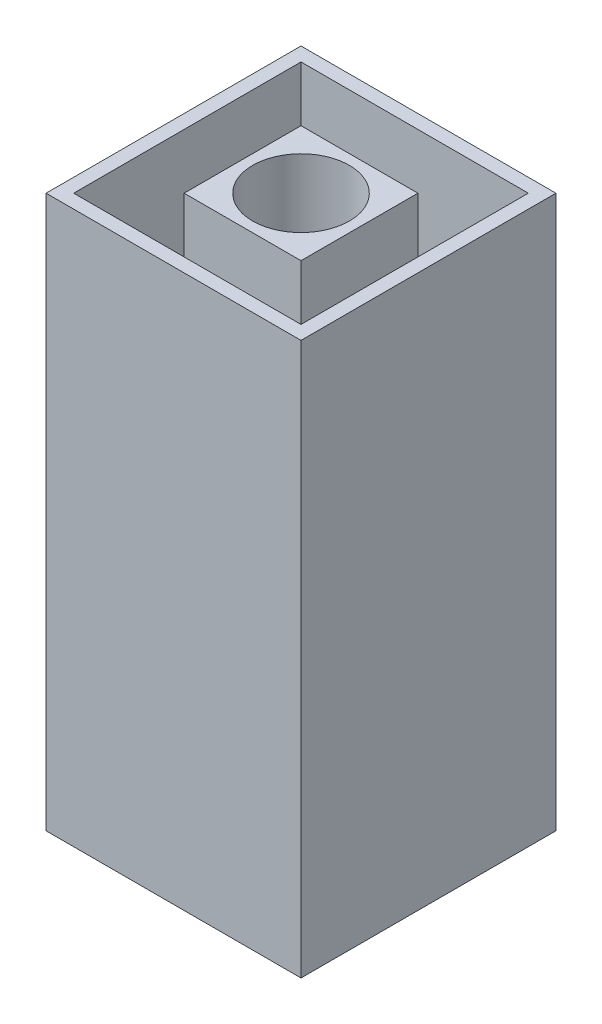
ISO-10303-21;
HEADER;
FILE_DESCRIPTION(('STEP AP214'),'2;1');
FILE_NAME('part.step','',(''),(''),'','','');
FILE_SCHEMA(('AUTOMOTIVE_DESIGN { 1 0 10303 214 1 1 1 1 }'));
ENDSEC;
DATA;
#1=APPLICATION_CONTEXT('core data for automotive mechanical design processes');
#2=APPLICATION_PROTOCOL_DEFINITION('international standard','automotive_design',2000,#1);
#3=PRODUCT_CONTEXT('',#1,'mechanical');
#4=PRODUCT('Part','Part','',(#3));
#5=PRODUCT_RELATED_PRODUCT_CATEGORY('part','',(#4));
#6=PRODUCT_DEFINITION_FORMATION('','',#4);
#7=PRODUCT_DEFINITION_CONTEXT('part definition',#1,'design');
#8=PRODUCT_DEFINITION('design','',#6,#7);
#9=PRODUCT_DEFINITION_SHAPE('','',#8);
#10=(LENGTH_UNIT() NAMED_UNIT(*) SI_UNIT(.MILLI.,.METRE.));
#11=(NAMED_UNIT(*) PLANE_ANGLE_UNIT() SI_UNIT($,.RADIAN.));
#12=(NAMED_UNIT(*) SI_UNIT($,.STERADIAN.) SOLID_ANGLE_UNIT());
#13=UNCERTAINTY_MEASURE_WITH_UNIT(LENGTH_MEASURE(1.E-05),#10,'distance_accuracy_value','');
#14=(GEOMETRIC_REPRESENTATION_CONTEXT(3) GLOBAL_UNCERTAINTY_ASSIGNED_CONTEXT((#13)) GLOBAL_UNIT_ASSIGNED_CONTEXT((#10,
#11,#12)) REPRESENTATION_CONTEXT('',''));
#15=CARTESIAN_POINT('',(0.,0.,0.));
#16=DIRECTION('',(0.,0.,1.));
#17=DIRECTION('',(1.,0.,0.));
#18=AXIS2_PLACEMENT_3D('',#15,#16,#17);
#19=CARTESIAN_POINT('',(1.385,6.,-1.385));
#20=DIRECTION('',(-1.,0.,0.));
#21=DIRECTION('',(0.,0.,1.));
#22=AXIS2_PLACEMENT_3D('',#19,#20,#21);
#23=PLANE('',#22);
#24=DIRECTION('',(0.,0.,-1.));
#25=VECTOR('',#24,1.);
#26=CARTESIAN_POINT('',(1.385,0.,-1.385));
#27=LINE('',#26,#25);
#28=CARTESIAN_POINT('',(1.385,0.,1.385));
#29=VERTEX_POINT('',#28);
#30=CARTESIAN_POINT('',(1.385,0.,-1.385));
#31=VERTEX_POINT('',#30);
#32=EDGE_CURVE('E130',#29,#31,#27,.T.);
#33=ORIENTED_EDGE('',*,*,#32,.T.);
#34=DIRECTION('',(0.,-1.,0.));
#35=VECTOR('',#34,1.);
#36=CARTESIAN_POINT('',(1.385,6.,-1.385));
#37=LINE('',#36,#35);
#38=CARTESIAN_POINT('',(1.385,6.,-1.385));
#39=VERTEX_POINT('',#38);
#40=EDGE_CURVE('E178',#39,#31,#37,.T.);
#41=ORIENTED_EDGE('',*,*,#40,.F.);
#42=DIRECTION('',(0.,0.,-1.));
#43=VECTOR('',#42,1.);
#44=CARTESIAN_POINT('',(1.385,6.,-1.385));
#45=LINE('',#44,#43);
#46=CARTESIAN_POINT('',(1.385,6.,1.385));
#47=VERTEX_POINT('',#46);
#48=EDGE_CURVE('E132',#47,#39,#45,.T.);
#49=ORIENTED_EDGE('',*,*,#48,.F.);
#50=DIRECTION('',(0.,-1.,0.));
#51=VECTOR('',#50,1.);
#52=CARTESIAN_POINT('',(1.385,6.,1.385));
#53=LINE('',#52,#51);
#54=EDGE_CURVE('E118',#47,#29,#53,.T.);
#55=ORIENTED_EDGE('',*,*,#54,.T.);
#56=EDGE_LOOP('',(#33,#41,#49,#55));
#57=FACE_BOUND('',#56,.T.);
#58=ADVANCED_FACE('F42',(#57),#23,.F.);
#59=CARTESIAN_POINT('',(-1.385,6.,-1.385));
#60=DIRECTION('',(0.,0.,1.));
#61=DIRECTION('',(1.,0.,0.));
#62=AXIS2_PLACEMENT_3D('',#59,#60,#61);
#63=PLANE('',#62);
#64=DIRECTION('',(-1.,0.,0.));
#65=VECTOR('',#64,1.);
#66=CARTESIAN_POINT('',(-1.385,0.,-1.385));
#67=LINE('',#66,#65);
#68=CARTESIAN_POINT('',(-1.385,0.,-1.385));
#69=VERTEX_POINT('',#68);
#70=EDGE_CURVE('E133',#31,#69,#67,.T.);
#71=ORIENTED_EDGE('',*,*,#70,.T.);
#72=DIRECTION('',(0.,-1.,0.));
#73=VECTOR('',#72,1.);
#74=CARTESIAN_POINT('',(-1.385,6.,-1.385));
#75=LINE('',#74,#73);
#76=CARTESIAN_POINT('',(-1.385,6.,-1.385));
#77=VERTEX_POINT('',#76);
#78=EDGE_CURVE('E125',#77,#69,#75,.T.);
#79=ORIENTED_EDGE('',*,*,#78,.F.);
#80=DIRECTION('',(-1.,0.,0.));
#81=VECTOR('',#80,1.);
#82=CARTESIAN_POINT('',(-1.385,6.,-1.385));
#83=LINE('',#82,#81);
#84=EDGE_CURVE('E145',#39,#77,#83,.T.);
#85=ORIENTED_EDGE('',*,*,#84,.F.);
#86=ORIENTED_EDGE('',*,*,#40,.T.);
#87=EDGE_LOOP('',(#71,#79,#85,#86));
#88=FACE_BOUND('',#87,.T.);
#89=ADVANCED_FACE('F188',(#88),#63,.F.);
#90=CARTESIAN_POINT('',(-1.385,6.,-1.385));
#91=DIRECTION('',(1.,0.,0.));
#92=DIRECTION('',(0.,0.,-1.));
#93=AXIS2_PLACEMENT_3D('',#90,#91,#92);
#94=PLANE('',#93);
#95=DIRECTION('',(0.,0.,1.));
#96=VECTOR('',#95,1.);
#97=CARTESIAN_POINT('',(-1.385,0.,-1.385));
#98=LINE('',#97,#96);
#99=CARTESIAN_POINT('',(-1.385,0.,1.385));
#100=VERTEX_POINT('',#99);
#101=EDGE_CURVE('E180',#69,#100,#98,.T.);
#102=ORIENTED_EDGE('',*,*,#101,.T.);
#103=DIRECTION('',(0.,-1.,0.));
#104=VECTOR('',#103,1.);
#105=CARTESIAN_POINT('',(-1.385,6.,1.385));
#106=LINE('',#105,#104);
#107=CARTESIAN_POINT('',(-1.385,6.,1.385));
#108=VERTEX_POINT('',#107);
#109=EDGE_CURVE('E121',#108,#100,#106,.T.);
#110=ORIENTED_EDGE('',*,*,#109,.F.);
#111=DIRECTION('',(0.,0.,1.));
#112=VECTOR('',#111,1.);
#113=CARTESIAN_POINT('',(-1.385,6.,-1.385));
#114=LINE('',#113,#112);
#115=EDGE_CURVE('E143',#77,#108,#114,.T.);
#116=ORIENTED_EDGE('',*,*,#115,.F.);
#117=ORIENTED_EDGE('',*,*,#78,.T.);
#118=EDGE_LOOP('',(#102,#110,#116,#117));
#119=FACE_BOUND('',#118,.T.);
#120=ADVANCED_FACE('F184',(#119),#94,.F.);
#121=CARTESIAN_POINT('',(-1.385,6.,1.385));
#122=DIRECTION('',(0.,0.,-1.));
#123=DIRECTION('',(-1.,0.,0.));
#124=AXIS2_PLACEMENT_3D('',#121,#122,#123);
#125=PLANE('',#124);
#126=DIRECTION('',(1.,0.,0.));
#127=VECTOR('',#126,1.);
#128=CARTESIAN_POINT('',(-1.385,0.,1.385));
#129=LINE('',#128,#127);
#130=EDGE_CURVE('E114',#100,#29,#129,.T.);
#131=ORIENTED_EDGE('',*,*,#130,.T.);
#132=ORIENTED_EDGE('',*,*,#54,.F.);
#133=DIRECTION('',(1.,0.,0.));
#134=VECTOR('',#133,1.);
#135=CARTESIAN_POINT('',(-1.385,6.,1.385));
#136=LINE('',#135,#134);
#137=EDGE_CURVE('E140',#108,#47,#136,.T.);
#138=ORIENTED_EDGE('',*,*,#137,.F.);
#139=ORIENTED_EDGE('',*,*,#109,.T.);
#140=EDGE_LOOP('',(#131,#132,#138,#139));
#141=FACE_BOUND('',#140,.T.);
#142=ADVANCED_FACE('F116',(#141),#125,.F.);
#143=CARTESIAN_POINT('',(1.385,6.,1.385));
#144=DIRECTION('',(0.,1.,0.));
#145=DIRECTION('',(0.,0.,1.));
#146=AXIS2_PLACEMENT_3D('',#143,#144,#145);
#147=PLANE('',#146);
#148=DIRECTION('',(0.,0.,1.));
#149=VECTOR('',#148,1.);
#150=CARTESIAN_POINT('',(-1.235,6.,-1.235));
#151=LINE('',#150,#149);
#152=CARTESIAN_POINT('',(-1.235,6.,-1.235));
#153=VERTEX_POINT('',#152);
#154=CARTESIAN_POINT('',(-1.235,6.,1.235));
#155=VERTEX_POINT('',#154);
#156=EDGE_CURVE('E46',#153,#155,#151,.T.);
#157=ORIENTED_EDGE('',*,*,#156,.F.);
#158=DIRECTION('',(-1.,0.,0.));
#159=VECTOR('',#158,1.);
#160=CARTESIAN_POINT('',(-1.235,6.,-1.235));
#161=LINE('',#160,#159);
#162=CARTESIAN_POINT('',(1.235,6.,-1.235));
#163=VERTEX_POINT('',#162);
#164=EDGE_CURVE('E153',#163,#153,#161,.T.);
#165=ORIENTED_EDGE('',*,*,#164,.F.);
#166=DIRECTION('',(0.,0.,-1.));
#167=VECTOR('',#166,1.);
#168=CARTESIAN_POINT('',(1.235,6.,-1.235));
#169=LINE('',#168,#167);
#170=CARTESIAN_POINT('',(1.235,6.,1.235));
#171=VERTEX_POINT('',#170);
#172=EDGE_CURVE('E149',#171,#163,#169,.T.);
#173=ORIENTED_EDGE('',*,*,#172,.F.);
#174=DIRECTION('',(1.,0.,0.));
#175=VECTOR('',#174,1.);
#176=CARTESIAN_POINT('',(-1.235,6.,1.235));
#177=LINE('',#176,#175);
#178=EDGE_CURVE('E12',#155,#171,#177,.T.);
#179=ORIENTED_EDGE('',*,*,#178,.F.);
#180=EDGE_LOOP('',(#157,#165,#173,#179));
#181=FACE_BOUND('',#180,.T.);
#182=ORIENTED_EDGE('',*,*,#48,.T.);
#183=ORIENTED_EDGE('',*,*,#84,.T.);
#184=ORIENTED_EDGE('',*,*,#115,.T.);
#185=ORIENTED_EDGE('',*,*,#137,.T.);
#186=EDGE_LOOP('',(#182,#183,#184,#185));
#187=FACE_BOUND('',#186,.T.);
#188=ADVANCED_FACE('F168',(#181,#187),#147,.T.);
#189=CARTESIAN_POINT('',(1.385,0.,1.385));
#190=DIRECTION('',(0.,1.,0.));
#191=DIRECTION('',(0.,0.,1.));
#192=AXIS2_PLACEMENT_3D('',#189,#190,#191);
#193=PLANE('',#192);
#194=DIRECTION('',(-1.,0.,0.));
#195=VECTOR('',#194,1.);
#196=CARTESIAN_POINT('',(1.385,0.,-1.235));
#197=LINE('',#196,#195);
#198=CARTESIAN_POINT('',(1.235,0.,-1.235));
#199=VERTEX_POINT('',#198);
#200=CARTESIAN_POINT('',(-1.235,0.,-1.235));
#201=VERTEX_POINT('',#200);
#202=EDGE_CURVE('E142',#199,#201,#197,.T.);
#203=ORIENTED_EDGE('',*,*,#202,.T.);
#204=DIRECTION('',(0.,0.,1.));
#205=VECTOR('',#204,1.);
#206=CARTESIAN_POINT('',(-1.235,0.,1.385));
#207=LINE('',#206,#205);
#208=CARTESIAN_POINT('',(-1.235,0.,1.235));
#209=VERTEX_POINT('',#208);
#210=EDGE_CURVE('E83',#201,#209,#207,.T.);
#211=ORIENTED_EDGE('',*,*,#210,.T.);
#212=DIRECTION('',(1.,0.,0.));
#213=VECTOR('',#212,1.);
#214=CARTESIAN_POINT('',(1.385,0.,1.235));
#215=LINE('',#214,#213);
#216=CARTESIAN_POINT('',(1.235,0.,1.235));
#217=VERTEX_POINT('',#216);
#218=EDGE_CURVE('E60',#209,#217,#215,.T.);
#219=ORIENTED_EDGE('',*,*,#218,.T.);
#220=DIRECTION('',(0.,0.,-1.));
#221=VECTOR('',#220,1.);
#222=CARTESIAN_POINT('',(1.235,0.,1.385));
#223=LINE('',#222,#221);
#224=EDGE_CURVE('E157',#217,#199,#223,.T.);
#225=ORIENTED_EDGE('',*,*,#224,.T.);
#226=EDGE_LOOP('',(#203,#211,#219,#225));
#227=FACE_BOUND('',#226,.T.);
#228=ORIENTED_EDGE('',*,*,#32,.F.);
#229=ORIENTED_EDGE('',*,*,#130,.F.);
#230=ORIENTED_EDGE('',*,*,#101,.F.);
#231=ORIENTED_EDGE('',*,*,#70,.F.);
#232=EDGE_LOOP('',(#228,#229,#230,#231));
#233=FACE_BOUND('',#232,.T.);
#234=ADVANCED_FACE('F44',(#227,#233),#193,.F.);
#235=CARTESIAN_POINT('',(-1.235,-4.,-1.235));
#236=DIRECTION('',(-1.,0.,0.));
#237=DIRECTION('',(0.,0.,1.));
#238=AXIS2_PLACEMENT_3D('',#235,#236,#237);
#239=PLANE('',#238);
#240=DIRECTION('',(0.,1.,0.));
#241=VECTOR('',#240,1.);
#242=CARTESIAN_POINT('',(-1.235,-4.,-1.235));
#243=LINE('',#242,#241);
#244=EDGE_CURVE('E155',#201,#153,#243,.T.);
#245=ORIENTED_EDGE('',*,*,#244,.T.);
#246=ORIENTED_EDGE('',*,*,#156,.T.);
#247=DIRECTION('',(0.,1.,0.));
#248=VECTOR('',#247,1.);
#249=CARTESIAN_POINT('',(-1.235,-4.,1.235));
#250=LINE('',#249,#248);
#251=EDGE_CURVE('E52',#209,#155,#250,.T.);
#252=ORIENTED_EDGE('',*,*,#251,.F.);
#253=ORIENTED_EDGE('',*,*,#210,.F.);
#254=EDGE_LOOP('',(#245,#246,#252,#253));
#255=FACE_BOUND('',#254,.T.);
#256=ADVANCED_FACE('F194',(#255),#239,.F.);
#257=CARTESIAN_POINT('',(-1.235,-4.,-1.235));
#258=DIRECTION('',(0.,0.,-1.));
#259=DIRECTION('',(-1.,0.,0.));
#260=AXIS2_PLACEMENT_3D('',#257,#258,#259);
#261=PLANE('',#260);
#262=DIRECTION('',(0.,1.,0.));
#263=VECTOR('',#262,1.);
#264=CARTESIAN_POINT('',(1.235,-4.,-1.235));
#265=LINE('',#264,#263);
#266=EDGE_CURVE('E78',#199,#163,#265,.T.);
#267=ORIENTED_EDGE('',*,*,#266,.T.);
#268=ORIENTED_EDGE('',*,*,#164,.T.);
#269=ORIENTED_EDGE('',*,*,#244,.F.);
#270=ORIENTED_EDGE('',*,*,#202,.F.);
#271=EDGE_LOOP('',(#267,#268,#269,#270));
#272=FACE_BOUND('',#271,.T.);
#273=ADVANCED_FACE('F170',(#272),#261,.F.);
#274=CARTESIAN_POINT('',(1.235,-4.,-1.235));
#275=DIRECTION('',(1.,0.,0.));
#276=DIRECTION('',(0.,0.,-1.));
#277=AXIS2_PLACEMENT_3D('',#274,#275,#276);
#278=PLANE('',#277);
#279=DIRECTION('',(0.,1.,0.));
#280=VECTOR('',#279,1.);
#281=CARTESIAN_POINT('',(1.235,-4.,1.235));
#282=LINE('',#281,#280);
#283=EDGE_CURVE('E150',#217,#171,#282,.T.);
#284=ORIENTED_EDGE('',*,*,#283,.T.);
#285=ORIENTED_EDGE('',*,*,#172,.T.);
#286=ORIENTED_EDGE('',*,*,#266,.F.);
#287=ORIENTED_EDGE('',*,*,#224,.F.);
#288=EDGE_LOOP('',(#284,#285,#286,#287));
#289=FACE_BOUND('',#288,.T.);
#290=ADVANCED_FACE('F162',(#289),#278,.F.);
#291=CARTESIAN_POINT('',(-1.235,-4.,1.235));
#292=DIRECTION('',(0.,0.,1.));
#293=DIRECTION('',(1.,0.,0.));
#294=AXIS2_PLACEMENT_3D('',#291,#292,#293);
#295=PLANE('',#294);
#296=ORIENTED_EDGE('',*,*,#251,.T.);
#297=ORIENTED_EDGE('',*,*,#178,.T.);
#298=ORIENTED_EDGE('',*,*,#283,.F.);
#299=ORIENTED_EDGE('',*,*,#218,.F.);
#300=EDGE_LOOP('',(#296,#297,#298,#299));
#301=FACE_BOUND('',#300,.T.);
#302=ADVANCED_FACE('F208',(#301),#295,.F.);
#303=CLOSED_SHELL('',(#58,#89,#120,#142,#188,#234,#256,#273,#290,#302));
#304=MANIFOLD_SOLID_BREP('B2',#303);
#305=CARTESIAN_POINT('',(1.385,6.,1.385));
#306=DIRECTION('',(0.,1.,0.));
#307=DIRECTION('',(0.,0.,1.));
#308=AXIS2_PLACEMENT_3D('',#305,#306,#307);
#309=PLANE('',#308);
#310=CARTESIAN_POINT('',(0.,6.,0.));
#311=DIRECTION('',(0.,1.,0.));
#312=DIRECTION('',(0.,0.,1.));
#313=AXIS2_PLACEMENT_3D('',#310,#311,#312);
#314=CIRCLE('',#313,0.525);
#315=CARTESIAN_POINT('',(0.,6.,0.525));
#316=VERTEX_POINT('',#315);
#317=EDGE_CURVE('E336',#316,#316,#314,.T.);
#318=ORIENTED_EDGE('',*,*,#317,.F.);
#319=EDGE_LOOP('',(#318));
#320=FACE_BOUND('',#319,.T.);
#321=DIRECTION('',(-1.,0.,0.));
#322=VECTOR('',#321,1.);
#323=CARTESIAN_POINT('',(-0.635000000000001,6.,-0.635000000000001));
#324=LINE('',#323,#322);
#325=CARTESIAN_POINT('',(0.634999999999998,6.,-0.635000000000001));
#326=VERTEX_POINT('',#325);
#327=CARTESIAN_POINT('',(-0.635000000000001,6.,-0.635000000000001));
#328=VERTEX_POINT('',#327);
#329=EDGE_CURVE('E322',#326,#328,#324,.T.);
#330=ORIENTED_EDGE('',*,*,#329,.T.);
#331=DIRECTION('',(0.,0.,1.));
#332=VECTOR('',#331,1.);
#333=CARTESIAN_POINT('',(-0.635000000000001,6.,-0.635000000000001));
#334=LINE('',#333,#332);
#335=CARTESIAN_POINT('',(-0.635000000000001,6.,0.635000000000001));
#336=VERTEX_POINT('',#335);
#337=EDGE_CURVE('E332',#328,#336,#334,.T.);
#338=ORIENTED_EDGE('',*,*,#337,.T.);
#339=DIRECTION('',(1.,0.,0.));
#340=VECTOR('',#339,1.);
#341=CARTESIAN_POINT('',(-0.635000000000001,6.,0.635000000000001));
#342=LINE('',#341,#340);
#343=CARTESIAN_POINT('',(0.634999999999998,6.,0.635000000000001));
#344=VERTEX_POINT('',#343);
#345=EDGE_CURVE('E330',#336,#344,#342,.T.);
#346=ORIENTED_EDGE('',*,*,#345,.T.);
#347=DIRECTION('',(0.,0.,-1.));
#348=VECTOR('',#347,1.);
#349=CARTESIAN_POINT('',(0.634999999999998,6.,-0.635000000000001));
#350=LINE('',#349,#348);
#351=EDGE_CURVE('E287',#344,#326,#350,.T.);
#352=ORIENTED_EDGE('',*,*,#351,.T.);
#353=EDGE_LOOP('',(#330,#338,#346,#352));
#354=FACE_BOUND('',#353,.T.);
#355=ADVANCED_FACE('F272',(#320,#354),#309,.T.);
#356=CARTESIAN_POINT('',(0.,0.,0.));
#357=DIRECTION('',(0.,1.,0.));
#358=DIRECTION('',(0.,0.,1.));
#359=AXIS2_PLACEMENT_3D('',#356,#357,#358);
#360=CYLINDRICAL_SURFACE('',#359,0.525);
#361=CARTESIAN_POINT('',(0.,0.,0.));
#362=DIRECTION('',(0.,1.,0.));
#363=DIRECTION('',(0.,0.,1.));
#364=AXIS2_PLACEMENT_3D('',#361,#362,#363);
#365=CIRCLE('',#364,0.525);
#366=CARTESIAN_POINT('',(0.,0.,0.525));
#367=VERTEX_POINT('',#366);
#368=EDGE_CURVE('E340',#367,#367,#365,.T.);
#369=ORIENTED_EDGE('',*,*,#368,.F.);
#370=EDGE_LOOP('',(#369));
#371=FACE_BOUND('',#370,.T.);
#372=ORIENTED_EDGE('',*,*,#317,.T.);
#373=EDGE_LOOP('',(#372));
#374=FACE_BOUND('',#373,.T.);
#375=ADVANCED_FACE('F360',(#371,#374),#360,.F.);
#376=CARTESIAN_POINT('',(1.385,0.,1.385));
#377=DIRECTION('',(0.,1.,0.));
#378=DIRECTION('',(0.,0.,1.));
#379=AXIS2_PLACEMENT_3D('',#376,#377,#378);
#380=PLANE('',#379);
#381=ORIENTED_EDGE('',*,*,#368,.T.);
#382=EDGE_LOOP('',(#381));
#383=FACE_BOUND('',#382,.T.);
#384=DIRECTION('',(0.,0.,1.));
#385=VECTOR('',#384,1.);
#386=CARTESIAN_POINT('',(-0.635000000000001,0.,1.385));
#387=LINE('',#386,#385);
#388=CARTESIAN_POINT('',(-0.635000000000001,0.,-0.635000000000001));
#389=VERTEX_POINT('',#388);
#390=CARTESIAN_POINT('',(-0.635000000000001,0.,0.635000000000001));
#391=VERTEX_POINT('',#390);
#392=EDGE_CURVE('E40',#389,#391,#387,.T.);
#393=ORIENTED_EDGE('',*,*,#392,.F.);
#394=DIRECTION('',(-1.,0.,0.));
#395=VECTOR('',#394,1.);
#396=CARTESIAN_POINT('',(1.385,0.,-0.635000000000001));
#397=LINE('',#396,#395);
#398=CARTESIAN_POINT('',(0.634999999999998,0.,-0.635000000000001));
#399=VERTEX_POINT('',#398);
#400=EDGE_CURVE('E280',#399,#389,#397,.T.);
#401=ORIENTED_EDGE('',*,*,#400,.F.);
#402=DIRECTION('',(0.,0.,-1.));
#403=VECTOR('',#402,1.);
#404=CARTESIAN_POINT('',(0.634999999999998,0.,1.385));
#405=LINE('',#404,#403);
#406=CARTESIAN_POINT('',(0.634999999999998,0.,0.635000000000001));
#407=VERTEX_POINT('',#406);
#408=EDGE_CURVE('E315',#407,#399,#405,.T.);
#409=ORIENTED_EDGE('',*,*,#408,.F.);
#410=DIRECTION('',(1.,0.,0.));
#411=VECTOR('',#410,1.);
#412=CARTESIAN_POINT('',(1.385,0.,0.635000000000001));
#413=LINE('',#412,#411);
#414=EDGE_CURVE('E343',#391,#407,#413,.T.);
#415=ORIENTED_EDGE('',*,*,#414,.F.);
#416=EDGE_LOOP('',(#393,#401,#409,#415));
#417=FACE_BOUND('',#416,.T.);
#418=ADVANCED_FACE('F274',(#383,#417),#380,.F.);
#419=CARTESIAN_POINT('',(-0.635000000000001,-4.,0.635000000000001));
#420=DIRECTION('',(0.,0.,1.));
#421=DIRECTION('',(1.,0.,0.));
#422=AXIS2_PLACEMENT_3D('',#419,#420,#421);
#423=PLANE('',#422);
#424=ORIENTED_EDGE('',*,*,#414,.T.);
#425=DIRECTION('',(0.,1.,0.));
#426=VECTOR('',#425,1.);
#427=CARTESIAN_POINT('',(0.634999999999998,-4.,0.635000000000001));
#428=LINE('',#427,#426);
#429=EDGE_CURVE('E319',#407,#344,#428,.T.);
#430=ORIENTED_EDGE('',*,*,#429,.T.);
#431=ORIENTED_EDGE('',*,*,#345,.F.);
#432=DIRECTION('',(0.,1.,0.));
#433=VECTOR('',#432,1.);
#434=CARTESIAN_POINT('',(-0.635000000000001,-4.,0.635000000000001));
#435=LINE('',#434,#433);
#436=EDGE_CURVE('E295',#391,#336,#435,.T.);
#437=ORIENTED_EDGE('',*,*,#436,.F.);
#438=EDGE_LOOP('',(#424,#430,#431,#437));
#439=FACE_BOUND('',#438,.T.);
#440=ADVANCED_FACE('F352',(#439),#423,.T.);
#441=CARTESIAN_POINT('',(0.634999999999998,-4.,-0.635000000000001));
#442=DIRECTION('',(1.,0.,0.));
#443=DIRECTION('',(0.,0.,-1.));
#444=AXIS2_PLACEMENT_3D('',#441,#442,#443);
#445=PLANE('',#444);
#446=ORIENTED_EDGE('',*,*,#408,.T.);
#447=DIRECTION('',(0.,1.,0.));
#448=VECTOR('',#447,1.);
#449=CARTESIAN_POINT('',(0.634999999999998,-4.,-0.635000000000001));
#450=LINE('',#449,#448);
#451=EDGE_CURVE('E311',#399,#326,#450,.T.);
#452=ORIENTED_EDGE('',*,*,#451,.T.);
#453=ORIENTED_EDGE('',*,*,#351,.F.);
#454=ORIENTED_EDGE('',*,*,#429,.F.);
#455=EDGE_LOOP('',(#446,#452,#453,#454));
#456=FACE_BOUND('',#455,.T.);
#457=ADVANCED_FACE('F313',(#456),#445,.T.);
#458=CARTESIAN_POINT('',(-0.635000000000001,-4.,-0.635000000000001));
#459=DIRECTION('',(0.,0.,-1.));
#460=DIRECTION('',(-1.,0.,0.));
#461=AXIS2_PLACEMENT_3D('',#458,#459,#460);
#462=PLANE('',#461);
#463=ORIENTED_EDGE('',*,*,#400,.T.);
#464=DIRECTION('',(0.,1.,0.));
#465=VECTOR('',#464,1.);
#466=CARTESIAN_POINT('',(-0.635000000000001,-4.,-0.635000000000001));
#467=LINE('',#466,#465);
#468=EDGE_CURVE('E318',#389,#328,#467,.T.);
#469=ORIENTED_EDGE('',*,*,#468,.T.);
#470=ORIENTED_EDGE('',*,*,#329,.F.);
#471=ORIENTED_EDGE('',*,*,#451,.F.);
#472=EDGE_LOOP('',(#463,#469,#470,#471));
#473=FACE_BOUND('',#472,.T.);
#474=ADVANCED_FACE('F323',(#473),#462,.T.);
#475=CARTESIAN_POINT('',(-0.635000000000001,-4.,-0.635000000000001));
#476=DIRECTION('',(-1.,0.,0.));
#477=DIRECTION('',(0.,0.,1.));
#478=AXIS2_PLACEMENT_3D('',#475,#476,#477);
#479=PLANE('',#478);
#480=ORIENTED_EDGE('',*,*,#392,.T.);
#481=ORIENTED_EDGE('',*,*,#436,.T.);
#482=ORIENTED_EDGE('',*,*,#337,.F.);
#483=ORIENTED_EDGE('',*,*,#468,.F.);
#484=EDGE_LOOP('',(#480,#481,#482,#483));
#485=FACE_BOUND('',#484,.T.);
#486=ADVANCED_FACE('F350',(#485),#479,.T.);
#487=CLOSED_SHELL('',(#355,#375,#418,#440,#457,#474,#486));
#488=MANIFOLD_SOLID_BREP('B6',#487);
#489=ADVANCED_BREP_SHAPE_REPRESENTATION('',(#18,#304,#488),#14);
#490=SHAPE_DEFINITION_REPRESENTATION(#9,#489);
ENDSEC;
END-ISO-10303-21;
